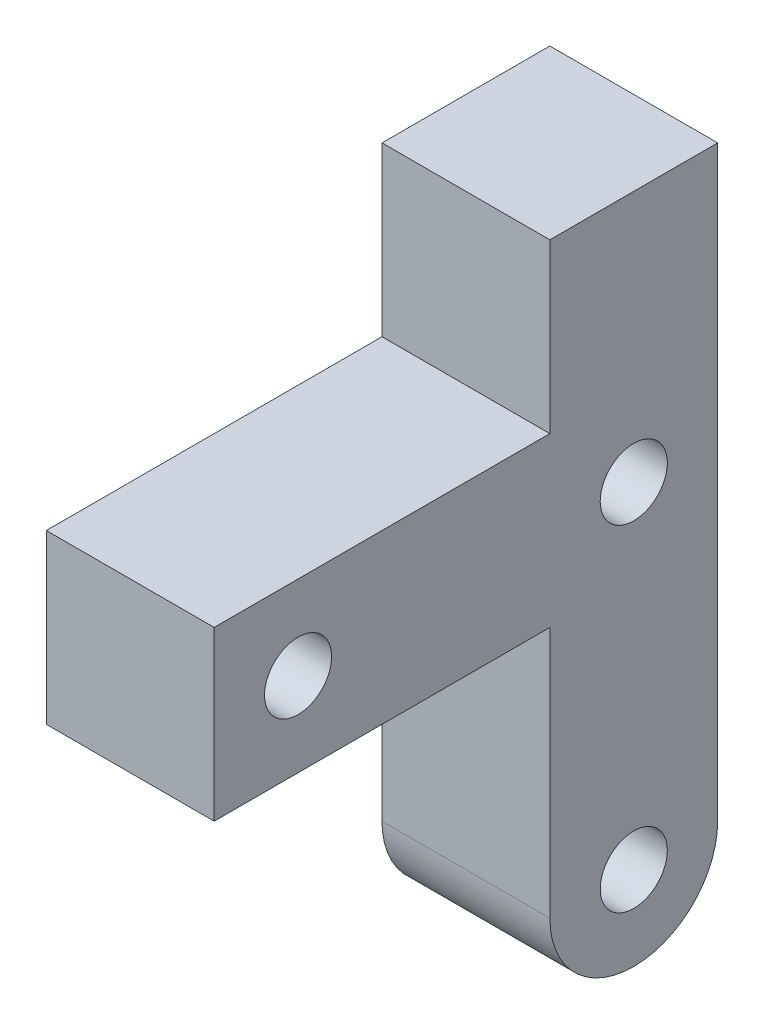
ISO-10303-21;
HEADER;
FILE_DESCRIPTION(('STEP AP214'),'2;1');
FILE_NAME('part.step','',(''),(''),'','','');
FILE_SCHEMA(('AUTOMOTIVE_DESIGN { 1 0 10303 214 1 1 1 1 }'));
ENDSEC;
DATA;
#1=APPLICATION_CONTEXT('core data for automotive mechanical design processes');
#2=APPLICATION_PROTOCOL_DEFINITION('international standard','automotive_design',2000,#1);
#3=PRODUCT_CONTEXT('',#1,'mechanical');
#4=PRODUCT('Part','Part','',(#3));
#5=PRODUCT_RELATED_PRODUCT_CATEGORY('part','',(#4));
#6=PRODUCT_DEFINITION_FORMATION('','',#4);
#7=PRODUCT_DEFINITION_CONTEXT('part definition',#1,'design');
#8=PRODUCT_DEFINITION('design','',#6,#7);
#9=PRODUCT_DEFINITION_SHAPE('','',#8);
#10=(LENGTH_UNIT() NAMED_UNIT(*) SI_UNIT(.MILLI.,.METRE.));
#11=(NAMED_UNIT(*) PLANE_ANGLE_UNIT() SI_UNIT($,.RADIAN.));
#12=(NAMED_UNIT(*) SI_UNIT($,.STERADIAN.) SOLID_ANGLE_UNIT());
#13=UNCERTAINTY_MEASURE_WITH_UNIT(LENGTH_MEASURE(1.E-05),#10,'distance_accuracy_value','');
#14=(GEOMETRIC_REPRESENTATION_CONTEXT(3) GLOBAL_UNCERTAINTY_ASSIGNED_CONTEXT((#13)) GLOBAL_UNIT_ASSIGNED_CONTEXT((#10,
#11,#12)) REPRESENTATION_CONTEXT('',''));
#15=CARTESIAN_POINT('',(0.,0.,0.));
#16=DIRECTION('',(0.,0.,1.));
#17=DIRECTION('',(1.,0.,0.));
#18=AXIS2_PLACEMENT_3D('',#15,#16,#17);
#19=CARTESIAN_POINT('',(0.,40.,10.));
#20=DIRECTION('',(0.,0.,-1.));
#21=DIRECTION('',(-1.,0.,0.));
#22=AXIS2_PLACEMENT_3D('',#19,#20,#21);
#23=PLANE('',#22);
#24=DIRECTION('',(-1.,0.,0.));
#25=VECTOR('',#24,1.);
#26=CARTESIAN_POINT('',(0.,30.,10.));
#27=LINE('',#26,#25);
#28=CARTESIAN_POINT('',(10.,30.,10.));
#29=VERTEX_POINT('',#28);
#30=CARTESIAN_POINT('',(0.,30.,10.));
#31=VERTEX_POINT('',#30);
#32=EDGE_CURVE('E121',#29,#31,#27,.T.);
#33=ORIENTED_EDGE('',*,*,#32,.F.);
#34=DIRECTION('',(0.,1.,0.));
#35=VECTOR('',#34,1.);
#36=CARTESIAN_POINT('',(10.,0.,10.));
#37=LINE('',#36,#35);
#38=CARTESIAN_POINT('',(10.,40.,10.));
#39=VERTEX_POINT('',#38);
#40=EDGE_CURVE('E161',#29,#39,#37,.T.);
#41=ORIENTED_EDGE('',*,*,#40,.T.);
#42=DIRECTION('',(-1.,0.,0.));
#43=VECTOR('',#42,1.);
#44=CARTESIAN_POINT('',(0.,40.,10.));
#45=LINE('',#44,#43);
#46=CARTESIAN_POINT('',(0.,40.,10.));
#47=VERTEX_POINT('',#46);
#48=EDGE_CURVE('E169',#39,#47,#45,.T.);
#49=ORIENTED_EDGE('',*,*,#48,.T.);
#50=DIRECTION('',(0.,-1.,0.));
#51=VECTOR('',#50,1.);
#52=CARTESIAN_POINT('',(0.,0.,10.));
#53=LINE('',#52,#51);
#54=EDGE_CURVE('E159',#47,#31,#53,.T.);
#55=ORIENTED_EDGE('',*,*,#54,.T.);
#56=EDGE_LOOP('',(#33,#41,#49,#55));
#57=FACE_BOUND('',#56,.T.);
#58=ADVANCED_FACE('F33',(#57),#23,.F.);
#59=CARTESIAN_POINT('',(0.,20.,10.));
#60=VERTEX_POINT('',#59);
#61=CARTESIAN_POINT('',(0.,5.,10.));
#62=VERTEX_POINT('',#61);
#63=EDGE_CURVE('E124',#60,#62,#53,.T.);
#64=ORIENTED_EDGE('',*,*,#63,.T.);
#65=DIRECTION('',(1.,0.,0.));
#66=VECTOR('',#65,1.);
#67=CARTESIAN_POINT('',(0.,5.,10.));
#68=LINE('',#67,#66);
#69=CARTESIAN_POINT('',(10.,5.,10.));
#70=VERTEX_POINT('',#69);
#71=EDGE_CURVE('E11',#62,#70,#68,.T.);
#72=ORIENTED_EDGE('',*,*,#71,.T.);
#73=CARTESIAN_POINT('',(10.,20.,10.));
#74=VERTEX_POINT('',#73);
#75=EDGE_CURVE('E174',#70,#74,#37,.T.);
#76=ORIENTED_EDGE('',*,*,#75,.T.);
#77=DIRECTION('',(1.,0.,0.));
#78=VECTOR('',#77,1.);
#79=CARTESIAN_POINT('',(0.,20.,10.));
#80=LINE('',#79,#78);
#81=EDGE_CURVE('E140',#60,#74,#80,.T.);
#82=ORIENTED_EDGE('',*,*,#81,.F.);
#83=EDGE_LOOP('',(#64,#72,#76,#82));
#84=FACE_BOUND('',#83,.T.);
#85=ADVANCED_FACE('F233',(#84),#23,.F.);
#86=CARTESIAN_POINT('',(0.,0.,10.));
#87=DIRECTION('',(1.,0.,0.));
#88=DIRECTION('',(0.,0.,-1.));
#89=AXIS2_PLACEMENT_3D('',#86,#87,#88);
#90=PLANE('',#89);
#91=CARTESIAN_POINT('',(0.,25.,5.));
#92=DIRECTION('',(-1.,0.,0.));
#93=DIRECTION('',(0.,0.,1.));
#94=AXIS2_PLACEMENT_3D('',#91,#92,#93);
#95=CIRCLE('',#94,2.);
#96=CARTESIAN_POINT('',(0.,25.,7.));
#97=VERTEX_POINT('',#96);
#98=EDGE_CURVE('E214',#97,#97,#95,.T.);
#99=ORIENTED_EDGE('',*,*,#98,.F.);
#100=EDGE_LOOP('',(#99));
#101=FACE_BOUND('',#100,.T.);
#102=CARTESIAN_POINT('',(0.,25.,25.));
#103=DIRECTION('',(-1.,0.,0.));
#104=DIRECTION('',(0.,0.,1.));
#105=AXIS2_PLACEMENT_3D('',#102,#103,#104);
#106=CIRCLE('',#105,2.00000000000001);
#107=CARTESIAN_POINT('',(0.,25.,27.));
#108=VERTEX_POINT('',#107);
#109=EDGE_CURVE('E220',#108,#108,#106,.T.);
#110=ORIENTED_EDGE('',*,*,#109,.F.);
#111=EDGE_LOOP('',(#110));
#112=FACE_BOUND('',#111,.T.);
#113=CARTESIAN_POINT('',(0.,5.,5.));
#114=DIRECTION('',(1.,0.,0.));
#115=DIRECTION('',(0.,0.,-1.));
#116=AXIS2_PLACEMENT_3D('',#113,#114,#115);
#117=CIRCLE('',#116,2.);
#118=CARTESIAN_POINT('',(0.,5.,3.));
#119=VERTEX_POINT('',#118);
#120=EDGE_CURVE('E128',#119,#119,#117,.F.);
#121=ORIENTED_EDGE('',*,*,#120,.F.);
#122=EDGE_LOOP('',(#121));
#123=FACE_BOUND('',#122,.T.);
#124=DIRECTION('',(0.,-1.,0.));
#125=VECTOR('',#124,1.);
#126=CARTESIAN_POINT('',(0.,0.,0.));
#127=LINE('',#126,#125);
#128=CARTESIAN_POINT('',(0.,40.,0.));
#129=VERTEX_POINT('',#128);
#130=CARTESIAN_POINT('',(0.,5.,0.));
#131=VERTEX_POINT('',#130);
#132=EDGE_CURVE('E150',#129,#131,#127,.T.);
#133=ORIENTED_EDGE('',*,*,#132,.T.);
#134=CARTESIAN_POINT('',(0.,5.,5.));
#135=DIRECTION('',(1.,0.,0.));
#136=DIRECTION('',(0.,0.,-1.));
#137=AXIS2_PLACEMENT_3D('',#134,#135,#136);
#138=CIRCLE('',#137,5.);
#139=CARTESIAN_POINT('',(0.,0.,5.));
#140=VERTEX_POINT('',#139);
#141=EDGE_CURVE('E42',#131,#140,#138,.F.);
#142=ORIENTED_EDGE('',*,*,#141,.T.);
#143=CARTESIAN_POINT('',(0.,5.,5.));
#144=DIRECTION('',(1.,0.,0.));
#145=DIRECTION('',(0.,0.,-1.));
#146=AXIS2_PLACEMENT_3D('',#143,#144,#145);
#147=CIRCLE('',#146,5.);
#148=EDGE_CURVE('E49',#140,#62,#147,.F.);
#149=ORIENTED_EDGE('',*,*,#148,.T.);
#150=ORIENTED_EDGE('',*,*,#63,.F.);
#151=DIRECTION('',(0.,0.,-1.));
#152=VECTOR('',#151,1.);
#153=CARTESIAN_POINT('',(0.,20.,30.));
#154=LINE('',#153,#152);
#155=CARTESIAN_POINT('',(0.,20.,30.));
#156=VERTEX_POINT('',#155);
#157=EDGE_CURVE('E107',#156,#60,#154,.T.);
#158=ORIENTED_EDGE('',*,*,#157,.F.);
#159=DIRECTION('',(0.,-1.,0.));
#160=VECTOR('',#159,1.);
#161=CARTESIAN_POINT('',(0.,30.,30.));
#162=LINE('',#161,#160);
#163=CARTESIAN_POINT('',(0.,30.,30.));
#164=VERTEX_POINT('',#163);
#165=EDGE_CURVE('E113',#164,#156,#162,.T.);
#166=ORIENTED_EDGE('',*,*,#165,.F.);
#167=DIRECTION('',(0.,0.,-1.));
#168=VECTOR('',#167,1.);
#169=CARTESIAN_POINT('',(0.,30.,30.));
#170=LINE('',#169,#168);
#171=EDGE_CURVE('E141',#164,#31,#170,.T.);
#172=ORIENTED_EDGE('',*,*,#171,.T.);
#173=ORIENTED_EDGE('',*,*,#54,.F.);
#174=DIRECTION('',(0.,0.,-1.));
#175=VECTOR('',#174,1.);
#176=CARTESIAN_POINT('',(0.,40.,10.));
#177=LINE('',#176,#175);
#178=EDGE_CURVE('E166',#47,#129,#177,.T.);
#179=ORIENTED_EDGE('',*,*,#178,.T.);
#180=EDGE_LOOP('',(#133,#142,#149,#150,#158,#166,#172,#173,#179));
#181=FACE_BOUND('',#180,.T.);
#182=ADVANCED_FACE('F123',(#101,#112,#123,#181),#90,.F.);
#183=CARTESIAN_POINT('',(10.,0.,10.));
#184=DIRECTION('',(-1.,0.,0.));
#185=DIRECTION('',(0.,0.,1.));
#186=AXIS2_PLACEMENT_3D('',#183,#184,#185);
#187=PLANE('',#186);
#188=CARTESIAN_POINT('',(10.,25.,5.));
#189=DIRECTION('',(-1.,0.,0.));
#190=DIRECTION('',(0.,0.,1.));
#191=AXIS2_PLACEMENT_3D('',#188,#189,#190);
#192=CIRCLE('',#191,2.);
#193=CARTESIAN_POINT('',(10.,25.,7.));
#194=VERTEX_POINT('',#193);
#195=EDGE_CURVE('E183',#194,#194,#192,.T.);
#196=ORIENTED_EDGE('',*,*,#195,.T.);
#197=EDGE_LOOP('',(#196));
#198=FACE_BOUND('',#197,.T.);
#199=CARTESIAN_POINT('',(10.,25.,25.));
#200=DIRECTION('',(-1.,0.,0.));
#201=DIRECTION('',(0.,0.,1.));
#202=AXIS2_PLACEMENT_3D('',#199,#200,#201);
#203=CIRCLE('',#202,2.00000000000001);
#204=CARTESIAN_POINT('',(10.,25.,27.));
#205=VERTEX_POINT('',#204);
#206=EDGE_CURVE('E224',#205,#205,#203,.F.);
#207=ORIENTED_EDGE('',*,*,#206,.F.);
#208=EDGE_LOOP('',(#207));
#209=FACE_BOUND('',#208,.T.);
#210=CARTESIAN_POINT('',(10.,5.,5.));
#211=DIRECTION('',(1.,0.,0.));
#212=DIRECTION('',(0.,0.,-1.));
#213=AXIS2_PLACEMENT_3D('',#210,#211,#212);
#214=CIRCLE('',#213,2.);
#215=CARTESIAN_POINT('',(10.,5.,3.));
#216=VERTEX_POINT('',#215);
#217=EDGE_CURVE('E125',#216,#216,#214,.T.);
#218=ORIENTED_EDGE('',*,*,#217,.F.);
#219=EDGE_LOOP('',(#218));
#220=FACE_BOUND('',#219,.T.);
#221=CARTESIAN_POINT('',(10.,5.,5.));
#222=DIRECTION('',(-1.,0.,0.));
#223=DIRECTION('',(0.,0.,1.));
#224=AXIS2_PLACEMENT_3D('',#221,#222,#223);
#225=CIRCLE('',#224,5.);
#226=CARTESIAN_POINT('',(10.,0.,5.));
#227=VERTEX_POINT('',#226);
#228=EDGE_CURVE('E165',#70,#227,#225,.F.);
#229=ORIENTED_EDGE('',*,*,#228,.T.);
#230=CARTESIAN_POINT('',(10.,5.,5.));
#231=DIRECTION('',(-1.,0.,0.));
#232=DIRECTION('',(0.,0.,1.));
#233=AXIS2_PLACEMENT_3D('',#230,#231,#232);
#234=CIRCLE('',#233,5.);
#235=CARTESIAN_POINT('',(10.,5.,0.));
#236=VERTEX_POINT('',#235);
#237=EDGE_CURVE('E186',#227,#236,#234,.F.);
#238=ORIENTED_EDGE('',*,*,#237,.T.);
#239=DIRECTION('',(0.,1.,0.));
#240=VECTOR('',#239,1.);
#241=CARTESIAN_POINT('',(10.,0.,0.));
#242=LINE('',#241,#240);
#243=CARTESIAN_POINT('',(10.,40.,0.));
#244=VERTEX_POINT('',#243);
#245=EDGE_CURVE('E172',#236,#244,#242,.T.);
#246=ORIENTED_EDGE('',*,*,#245,.T.);
#247=DIRECTION('',(0.,0.,-1.));
#248=VECTOR('',#247,1.);
#249=CARTESIAN_POINT('',(10.,40.,10.));
#250=LINE('',#249,#248);
#251=EDGE_CURVE('E162',#39,#244,#250,.T.);
#252=ORIENTED_EDGE('',*,*,#251,.F.);
#253=ORIENTED_EDGE('',*,*,#40,.F.);
#254=DIRECTION('',(0.,0.,-1.));
#255=VECTOR('',#254,1.);
#256=CARTESIAN_POINT('',(10.,30.,30.));
#257=LINE('',#256,#255);
#258=CARTESIAN_POINT('',(10.,30.,30.));
#259=VERTEX_POINT('',#258);
#260=EDGE_CURVE('E130',#259,#29,#257,.T.);
#261=ORIENTED_EDGE('',*,*,#260,.F.);
#262=DIRECTION('',(0.,1.,0.));
#263=VECTOR('',#262,1.);
#264=CARTESIAN_POINT('',(10.,30.,30.));
#265=LINE('',#264,#263);
#266=CARTESIAN_POINT('',(10.,20.,30.));
#267=VERTEX_POINT('',#266);
#268=EDGE_CURVE('E112',#267,#259,#265,.T.);
#269=ORIENTED_EDGE('',*,*,#268,.F.);
#270=DIRECTION('',(0.,0.,-1.));
#271=VECTOR('',#270,1.);
#272=CARTESIAN_POINT('',(10.,20.,30.));
#273=LINE('',#272,#271);
#274=EDGE_CURVE('E109',#267,#74,#273,.T.);
#275=ORIENTED_EDGE('',*,*,#274,.T.);
#276=ORIENTED_EDGE('',*,*,#75,.F.);
#277=EDGE_LOOP('',(#229,#238,#246,#252,#253,#261,#269,#275,#276));
#278=FACE_BOUND('',#277,.T.);
#279=ADVANCED_FACE('F206',(#198,#209,#220,#278),#187,.F.);
#280=CARTESIAN_POINT('',(0.,40.,10.));
#281=DIRECTION('',(0.,-1.,0.));
#282=DIRECTION('',(0.,0.,-1.));
#283=AXIS2_PLACEMENT_3D('',#280,#281,#282);
#284=PLANE('',#283);
#285=DIRECTION('',(-1.,0.,0.));
#286=VECTOR('',#285,1.);
#287=CARTESIAN_POINT('',(0.,40.,0.));
#288=LINE('',#287,#286);
#289=EDGE_CURVE('E170',#244,#129,#288,.T.);
#290=ORIENTED_EDGE('',*,*,#289,.T.);
#291=ORIENTED_EDGE('',*,*,#178,.F.);
#292=ORIENTED_EDGE('',*,*,#48,.F.);
#293=ORIENTED_EDGE('',*,*,#251,.T.);
#294=EDGE_LOOP('',(#290,#291,#292,#293));
#295=FACE_BOUND('',#294,.T.);
#296=ADVANCED_FACE('F202',(#295),#284,.F.);
#297=CARTESIAN_POINT('',(0.,40.,0.));
#298=DIRECTION('',(0.,0.,-1.));
#299=DIRECTION('',(-1.,0.,0.));
#300=AXIS2_PLACEMENT_3D('',#297,#298,#299);
#301=PLANE('',#300);
#302=ORIENTED_EDGE('',*,*,#245,.F.);
#303=DIRECTION('',(1.,0.,0.));
#304=VECTOR('',#303,1.);
#305=CARTESIAN_POINT('',(0.,5.,0.));
#306=LINE('',#305,#304);
#307=EDGE_CURVE('E188',#236,#131,#306,.F.);
#308=ORIENTED_EDGE('',*,*,#307,.T.);
#309=ORIENTED_EDGE('',*,*,#132,.F.);
#310=ORIENTED_EDGE('',*,*,#289,.F.);
#311=EDGE_LOOP('',(#302,#308,#309,#310));
#312=FACE_BOUND('',#311,.T.);
#313=ADVANCED_FACE('F196',(#312),#301,.T.);
#314=CARTESIAN_POINT('',(-0.000999999999999265,5.,5.));
#315=DIRECTION('',(1.,0.,0.));
#316=DIRECTION('',(0.,0.,-1.));
#317=AXIS2_PLACEMENT_3D('',#314,#315,#316);
#318=CYLINDRICAL_SURFACE('',#317,2.);
#319=ORIENTED_EDGE('',*,*,#217,.T.);
#320=EDGE_LOOP('',(#319));
#321=FACE_BOUND('',#320,.T.);
#322=ORIENTED_EDGE('',*,*,#120,.T.);
#323=EDGE_LOOP('',(#322));
#324=FACE_BOUND('',#323,.T.);
#325=ADVANCED_FACE('F245',(#321,#324),#318,.F.);
#326=CARTESIAN_POINT('',(0.,20.,30.));
#327=DIRECTION('',(0.,1.,0.));
#328=DIRECTION('',(0.,0.,1.));
#329=AXIS2_PLACEMENT_3D('',#326,#327,#328);
#330=PLANE('',#329);
#331=ORIENTED_EDGE('',*,*,#81,.T.);
#332=ORIENTED_EDGE('',*,*,#274,.F.);
#333=DIRECTION('',(1.,0.,0.));
#334=VECTOR('',#333,1.);
#335=CARTESIAN_POINT('',(0.,20.,30.));
#336=LINE('',#335,#334);
#337=EDGE_CURVE('E102',#156,#267,#336,.T.);
#338=ORIENTED_EDGE('',*,*,#337,.F.);
#339=ORIENTED_EDGE('',*,*,#157,.T.);
#340=EDGE_LOOP('',(#331,#332,#338,#339));
#341=FACE_BOUND('',#340,.T.);
#342=ADVANCED_FACE('F105',(#341),#330,.F.);
#343=CARTESIAN_POINT('',(0.,30.,30.));
#344=DIRECTION('',(0.,-1.,0.));
#345=DIRECTION('',(0.,0.,-1.));
#346=AXIS2_PLACEMENT_3D('',#343,#344,#345);
#347=PLANE('',#346);
#348=ORIENTED_EDGE('',*,*,#32,.T.);
#349=ORIENTED_EDGE('',*,*,#171,.F.);
#350=DIRECTION('',(-1.,0.,0.));
#351=VECTOR('',#350,1.);
#352=CARTESIAN_POINT('',(0.,30.,30.));
#353=LINE('',#352,#351);
#354=EDGE_CURVE('E118',#259,#164,#353,.T.);
#355=ORIENTED_EDGE('',*,*,#354,.F.);
#356=ORIENTED_EDGE('',*,*,#260,.T.);
#357=EDGE_LOOP('',(#348,#349,#355,#356));
#358=FACE_BOUND('',#357,.T.);
#359=ADVANCED_FACE('F231',(#358),#347,.F.);
#360=CARTESIAN_POINT('',(0.,20.,30.));
#361=DIRECTION('',(0.,0.,1.));
#362=DIRECTION('',(1.,0.,0.));
#363=AXIS2_PLACEMENT_3D('',#360,#361,#362);
#364=PLANE('',#363);
#365=ORIENTED_EDGE('',*,*,#165,.T.);
#366=ORIENTED_EDGE('',*,*,#337,.T.);
#367=ORIENTED_EDGE('',*,*,#268,.T.);
#368=ORIENTED_EDGE('',*,*,#354,.T.);
#369=EDGE_LOOP('',(#365,#366,#367,#368));
#370=FACE_BOUND('',#369,.T.);
#371=ADVANCED_FACE('F116',(#370),#364,.T.);
#372=CARTESIAN_POINT('',(10.00105,25.,25.));
#373=DIRECTION('',(-1.,0.,0.));
#374=DIRECTION('',(0.,0.,1.));
#375=AXIS2_PLACEMENT_3D('',#372,#373,#374);
#376=CYLINDRICAL_SURFACE('',#375,2.00000000000001);
#377=ORIENTED_EDGE('',*,*,#109,.T.);
#378=EDGE_LOOP('',(#377));
#379=FACE_BOUND('',#378,.T.);
#380=ORIENTED_EDGE('',*,*,#206,.T.);
#381=EDGE_LOOP('',(#380));
#382=FACE_BOUND('',#381,.T.);
#383=ADVANCED_FACE('F261',(#379,#382),#376,.F.);
#384=CARTESIAN_POINT('',(10.00005,25.,5.));
#385=DIRECTION('',(-1.,0.,0.));
#386=DIRECTION('',(0.,0.,1.));
#387=AXIS2_PLACEMENT_3D('',#384,#385,#386);
#388=CYLINDRICAL_SURFACE('',#387,2.);
#389=ORIENTED_EDGE('',*,*,#98,.T.);
#390=EDGE_LOOP('',(#389));
#391=FACE_BOUND('',#390,.T.);
#392=ORIENTED_EDGE('',*,*,#195,.F.);
#393=EDGE_LOOP('',(#392));
#394=FACE_BOUND('',#393,.T.);
#395=ADVANCED_FACE('F257',(#391,#394),#388,.F.);
#396=CARTESIAN_POINT('',(0.,5.,5.));
#397=DIRECTION('',(1.,0.,0.));
#398=DIRECTION('',(0.,0.,-1.));
#399=AXIS2_PLACEMENT_3D('',#396,#397,#398);
#400=CYLINDRICAL_SURFACE('',#399,5.);
#401=ORIENTED_EDGE('',*,*,#71,.F.);
#402=ORIENTED_EDGE('',*,*,#148,.F.);
#403=DIRECTION('',(1.,0.,0.));
#404=VECTOR('',#403,1.);
#405=CARTESIAN_POINT('',(0.,0.,5.));
#406=LINE('',#405,#404);
#407=EDGE_CURVE('E37',#227,#140,#406,.F.);
#408=ORIENTED_EDGE('',*,*,#407,.F.);
#409=ORIENTED_EDGE('',*,*,#228,.F.);
#410=EDGE_LOOP('',(#401,#402,#408,#409));
#411=FACE_BOUND('',#410,.T.);
#412=ADVANCED_FACE('F35',(#411),#400,.T.);
#413=CARTESIAN_POINT('',(0.,5.,5.));
#414=DIRECTION('',(-1.,0.,0.));
#415=DIRECTION('',(0.,0.,1.));
#416=AXIS2_PLACEMENT_3D('',#413,#414,#415);
#417=CYLINDRICAL_SURFACE('',#416,5.);
#418=ORIENTED_EDGE('',*,*,#141,.F.);
#419=ORIENTED_EDGE('',*,*,#307,.F.);
#420=ORIENTED_EDGE('',*,*,#237,.F.);
#421=ORIENTED_EDGE('',*,*,#407,.T.);
#422=EDGE_LOOP('',(#418,#419,#420,#421));
#423=FACE_BOUND('',#422,.T.);
#424=ADVANCED_FACE('F212',(#423),#417,.T.);
#425=CLOSED_SHELL('',(#58,#85,#182,#279,#296,#313,#325,#342,#359,#371,#383,#395,#412,#424));
#426=MANIFOLD_SOLID_BREP('B2',#425);
#427=ADVANCED_BREP_SHAPE_REPRESENTATION('',(#18,#426),#14);
#428=SHAPE_DEFINITION_REPRESENTATION(#9,#427);
ENDSEC;
END-ISO-10303-21;
